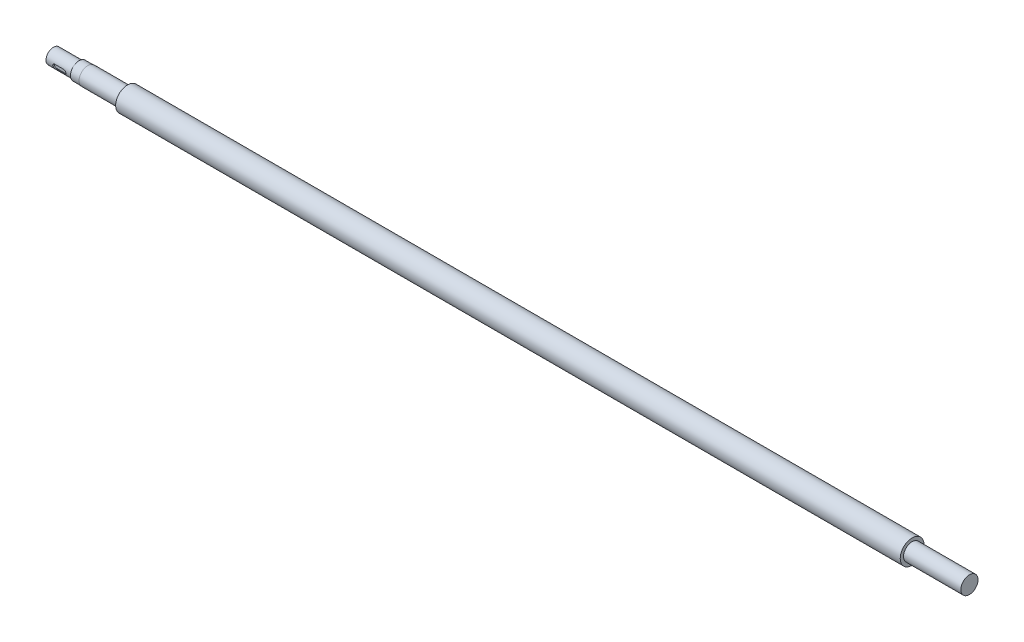
ISO-10303-21;
HEADER;
FILE_DESCRIPTION(('STEP AP214'),'2;1');
FILE_NAME('part.step','',(''),(''),'','','');
FILE_SCHEMA(('AUTOMOTIVE_DESIGN { 1 0 10303 214 1 1 1 1 }'));
ENDSEC;
DATA;
#1=APPLICATION_CONTEXT('core data for automotive mechanical design processes');
#2=APPLICATION_PROTOCOL_DEFINITION('international standard','automotive_design',2000,#1);
#3=PRODUCT_CONTEXT('',#1,'mechanical');
#4=PRODUCT('Part','Part','',(#3));
#5=PRODUCT_RELATED_PRODUCT_CATEGORY('part','',(#4));
#6=PRODUCT_DEFINITION_FORMATION('','',#4);
#7=PRODUCT_DEFINITION_CONTEXT('part definition',#1,'design');
#8=PRODUCT_DEFINITION('design','',#6,#7);
#9=PRODUCT_DEFINITION_SHAPE('','',#8);
#10=(LENGTH_UNIT() NAMED_UNIT(*) SI_UNIT(.MILLI.,.METRE.));
#11=(NAMED_UNIT(*) PLANE_ANGLE_UNIT() SI_UNIT($,.RADIAN.));
#12=(NAMED_UNIT(*) SI_UNIT($,.STERADIAN.) SOLID_ANGLE_UNIT());
#13=UNCERTAINTY_MEASURE_WITH_UNIT(LENGTH_MEASURE(1.E-05),#10,'distance_accuracy_value','');
#14=(GEOMETRIC_REPRESENTATION_CONTEXT(3) GLOBAL_UNCERTAINTY_ASSIGNED_CONTEXT((#13)) GLOBAL_UNIT_ASSIGNED_CONTEXT((#10,
#11,#12)) REPRESENTATION_CONTEXT('',''));
#15=CARTESIAN_POINT('',(0.,0.,0.));
#16=DIRECTION('',(0.,0.,1.));
#17=DIRECTION('',(1.,0.,0.));
#18=AXIS2_PLACEMENT_3D('',#15,#16,#17);
#19=CARTESIAN_POINT('',(0.,0.,0.));
#20=DIRECTION('',(1.,0.,0.));
#21=DIRECTION('',(0.,0.,-1.));
#22=AXIS2_PLACEMENT_3D('',#19,#20,#21);
#23=PLANE('',#22);
#24=CARTESIAN_POINT('',(0.,0.,0.));
#25=DIRECTION('',(-1.,0.,0.));
#26=DIRECTION('',(0.,0.,1.));
#27=AXIS2_PLACEMENT_3D('',#24,#25,#26);
#28=CIRCLE('',#27,17.);
#29=CARTESIAN_POINT('',(0.,0.,17.));
#30=VERTEX_POINT('',#29);
#31=EDGE_CURVE('E133',#30,#30,#28,.T.);
#32=ORIENTED_EDGE('',*,*,#31,.T.);
#33=EDGE_LOOP('',(#32));
#34=FACE_BOUND('',#33,.T.);
#35=ADVANCED_FACE('F38',(#34),#23,.F.);
#36=CARTESIAN_POINT('',(41.3003098914996,0.,0.));
#37=DIRECTION('',(-1.,0.,0.));
#38=DIRECTION('',(0.,0.,1.));
#39=AXIS2_PLACEMENT_3D('',#36,#37,#38);
#40=CYLINDRICAL_SURFACE('',#39,17.);
#41=DIRECTION('',(-1.,0.,0.));
#42=VECTOR('',#41,1.);
#43=CARTESIAN_POINT('',(41.3003098914996,2.,16.8819430161341));
#44=LINE('',#43,#42);
#45=CARTESIAN_POINT('',(20.,2.,16.8819430161341));
#46=VERTEX_POINT('',#45);
#47=CARTESIAN_POINT('',(40.,2.,16.8819430161341));
#48=VERTEX_POINT('',#47);
#49=EDGE_CURVE('E11',#46,#48,#44,.F.);
#50=ORIENTED_EDGE('',*,*,#49,.T.);
#51=CARTESIAN_POINT('',(40.,2.,16.8819430161341));
#52=CARTESIAN_POINT('',(40.1403222273669,2.00001567479681,16.8819278889937));
#53=CARTESIAN_POINT('',(40.2806410056206,1.9940935757898,16.8826423415651));
#54=CARTESIAN_POINT('',(40.5602602282256,1.97048795694987,16.8854208735801));
#55=CARTESIAN_POINT('',(40.6995607623758,1.95280548722904,16.8874848325226));
#56=CARTESIAN_POINT('',(40.9760186933886,1.90581680415216,16.8928501877262));
#57=CARTESIAN_POINT('',(41.1131781005863,1.87652227286804,16.8961503401575));
#58=CARTESIAN_POINT('',(41.3845251020808,1.80652883261543,16.9037776858345));
#59=CARTESIAN_POINT('',(41.5187127035777,1.7658299512808,16.9081048765916));
#60=CARTESIAN_POINT('',(41.7831871142466,1.67331500965025,16.9175108892276));
#61=CARTESIAN_POINT('',(41.9134735157344,1.62149779205161,16.9225897893345));
#62=CARTESIAN_POINT('',(42.1692697648038,1.50709505174714,16.933161669156));
#63=CARTESIAN_POINT('',(42.2947778216909,1.44450553967831,16.9386548018507));
#64=CARTESIAN_POINT('',(42.5400434875581,1.3090367667756,16.9496618392796));
#65=CARTESIAN_POINT('',(42.6598034440809,1.2361617553239,16.9551757345248));
#66=CARTESIAN_POINT('',(42.8928392236823,1.08057795485057,16.9658018032144));
#67=CARTESIAN_POINT('',(43.0061126298478,0.997865535241607,16.9709138271811));
#68=CARTESIAN_POINT('',(43.2257358603045,0.822880251197485,16.980299477548));
#69=CARTESIAN_POINT('',(43.3320588564612,0.730573537641243,16.9845699702717));
#70=CARTESIAN_POINT('',(43.5366061719683,0.537262504106854,16.9917834504762));
#71=CARTESIAN_POINT('',(43.634827461676,0.43625495904896,16.9947259431728));
#72=CARTESIAN_POINT('',(43.8223846195722,0.226326220770309,16.9988173582785));
#73=CARTESIAN_POINT('',(43.9117234126301,0.117407653108047,16.9999668729314));
#74=CARTESIAN_POINT('',(44.0809271302538,-0.10762085977029,17.000031718524));
#75=CARTESIAN_POINT('',(44.1607886215112,-0.223733388071752,16.998946242399));
#76=CARTESIAN_POINT('',(44.3095291814756,-0.4608438585045,16.9941612355899));
#77=CARTESIAN_POINT('',(44.3785261789853,-0.581768440461004,16.9904925441757));
#78=CARTESIAN_POINT('',(44.506180401007,-0.828897295209425,16.9802304711364));
#79=CARTESIAN_POINT('',(44.5648338098989,-0.955103495170882,16.9736360133736));
#80=CARTESIAN_POINT('',(44.6713280574052,-1.211710627626,16.9572483933328));
#81=CARTESIAN_POINT('',(44.7191752904622,-1.34210902696337,16.9474571311649));
#82=CARTESIAN_POINT('',(44.8038084619379,-1.60620611775105,16.9244698558267));
#83=CARTESIAN_POINT('',(44.8405903737485,-1.73990599148478,16.9112726064747));
#84=CARTESIAN_POINT('',(44.9021930135843,-2.0066119936337,16.8816795033758));
#85=CARTESIAN_POINT('',(44.9272551872938,-2.13957060776595,16.865358985858));
#86=CARTESIAN_POINT('',(44.9665057347858,-2.40664301200849,16.8293281586242));
#87=CARTESIAN_POINT('',(44.9806901928683,-2.54075720054486,16.8096166313546));
#88=CARTESIAN_POINT('',(45.0068851768108,-2.94327968023759,16.7454635106077));
#89=CARTESIAN_POINT('',(45.0025981803358,-3.21213451312903,16.6959741482358));
#90=CARTESIAN_POINT('',(44.951402903607,-3.745922614755,16.5844323030533));
#91=CARTESIAN_POINT('',(44.9040378933794,-4.01078287449915,16.5222507436216));
#92=CARTESIAN_POINT('',(44.768506782826,-4.52730291933443,16.3882504830808));
#93=CARTESIAN_POINT('',(44.6803308991532,-4.77895952307754,16.3164294740969));
#94=CARTESIAN_POINT('',(44.4602282341012,-5.27694866510653,16.1624699293598));
#95=CARTESIAN_POINT('',(44.326161610727,-5.52222685230617,16.0799811686927));
#96=CARTESIAN_POINT('',(44.0195996536521,-5.98669945101962,15.912902656451));
#97=CARTESIAN_POINT('',(43.8470873201682,-6.20588225779206,15.8283119902105));
#98=CARTESIAN_POINT('',(43.4574787292029,-6.62372234913186,15.6582147486971));
#99=CARTESIAN_POINT('',(43.2385659981033,-6.82077635574224,15.5728790377374));
#100=CARTESIAN_POINT('',(42.8851551790619,-7.08628063631349,15.4529654641675));
#101=CARTESIAN_POINT('',(42.7630831856744,-7.16981746203227,15.4143182562014));
#102=CARTESIAN_POINT('',(42.5112438093509,-7.32615068676402,15.340631060162));
#103=CARTESIAN_POINT('',(42.381480398449,-7.39895256296918,15.3055892353258));
#104=CARTESIAN_POINT('',(42.1191632082884,-7.53100979048902,15.2410346162796));
#105=CARTESIAN_POINT('',(41.9868181670276,-7.59061305630181,15.2113848651121));
#106=CARTESIAN_POINT('',(41.7166026775204,-7.69834135541057,15.1571493932557));
#107=CARTESIAN_POINT('',(41.5787352609854,-7.74647258849831,15.1325609382921));
#108=CARTESIAN_POINT('',(41.2987506058168,-7.83058725064102,15.0892061635289));
#109=CARTESIAN_POINT('',(41.1566422985999,-7.8665944844881,15.0704284406253));
#110=CARTESIAN_POINT('',(40.8692093191701,-7.92605200391817,15.0392430438543));
#111=CARTESIAN_POINT('',(40.7238868850215,-7.94951075736574,15.0268310745339));
#112=CARTESIAN_POINT('',(40.481849917018,-7.97766271745444,15.0118971119888));
#113=CARTESIAN_POINT('',(40.3856649657228,-7.98603797463698,15.0074403525339));
#114=CARTESIAN_POINT('',(40.1929918666699,-7.9972057997345,15.0014902934328));
#115=CARTESIAN_POINT('',(40.0965041954659,-8.00000478380349,14.9999935879132));
#116=CARTESIAN_POINT('',(40.,-8.,15.));
#117=B_SPLINE_CURVE_WITH_KNOTS('',3,(#51,#52,#53,#54,#55,#56,#57,#58,#59,#60,#61,#62,#63,#64,
#65,#66,#67,#68,#69,#70,#71,#72,#73,#74,#75,#76,#77,#78,#79,#80,#81,#82,#83,#84,#85,#86,#87,#88,
#89,#90,#91,#92,#93,#94,#95,#96,#97,#98,#99,#100,#101,#102,#103,#104,#105,#106,#107,#108,#109,
#110,#111,#112,#113,#114,#115,#116),.UNSPECIFIED.,.F.,.F.,(4,2,2,2,2,2,2,2,2,2,2,2,2,2,2,2,2,2,
2,2,2,2,2,2,2,2,2,2,2,2,2,2,4),(0.,0.420834846241932,0.841632120161297,1.26200712983636,
1.6823811209097,2.1027988897716,2.52337269059569,2.94377324016905,3.36432942676606,
3.78642324646253,4.20867419971625,4.63078564851771,5.05304955032025,5.470355968218,
5.88781600467459,6.30502836244894,6.72239235831175,7.13073142919935,7.53921742282174,
8.35537459518074,9.18028716070733,10.0053975801061,10.8758957282786,11.7467795565502,
12.6618014417654,13.1199578450313,13.5778796725455,14.0217104258328,14.4653007745439,
14.9080150092776,15.3504301170635,15.6401922731837,15.9296208310723),.UNSPECIFIED.);
#118=CARTESIAN_POINT('',(40.,-8.,15.));
#119=VERTEX_POINT('',#118);
#120=EDGE_CURVE('E136',#48,#119,#117,.T.);
#121=ORIENTED_EDGE('',*,*,#120,.T.);
#122=DIRECTION('',(-1.,0.,0.));
#123=VECTOR('',#122,1.);
#124=CARTESIAN_POINT('',(41.3003098914996,-8.,15.));
#125=LINE('',#124,#123);
#126=CARTESIAN_POINT('',(20.,-8.,15.));
#127=VERTEX_POINT('',#126);
#128=EDGE_CURVE('E45',#119,#127,#125,.T.);
#129=ORIENTED_EDGE('',*,*,#128,.T.);
#130=CARTESIAN_POINT('',(20.,-8.,15.));
#131=CARTESIAN_POINT('',(19.8690633972678,-8.00002307897942,14.999973643391));
#132=CARTESIAN_POINT('',(19.7381399374462,-7.99485774640408,15.0027421771378));
#133=CARTESIAN_POINT('',(19.477378973735,-7.97432424011739,15.0136737744954));
#134=CARTESIAN_POINT('',(19.3475410119241,-7.95896061397999,15.0218344336682));
#135=CARTESIAN_POINT('',(19.0905058628226,-7.91830128646715,15.0433040970063));
#136=CARTESIAN_POINT('',(18.9632990426433,-7.89305324301968,15.0565883929604));
#137=CARTESIAN_POINT('',(18.7117838189699,-7.83293052725922,15.0879539734657));
#138=CARTESIAN_POINT('',(18.5874756278524,-7.79805515195983,15.1060356083142));
#139=CARTESIAN_POINT('',(18.3427704465566,-7.7191193705527,15.1465228762266));
#140=CARTESIAN_POINT('',(18.2223672722887,-7.67507439822824,15.1689212389558));
#141=CARTESIAN_POINT('',(17.9859330246604,-7.57819601697861,15.2175517653549));
#142=CARTESIAN_POINT('',(17.8699036273457,-7.52535928017961,15.2437853802929));
#143=CARTESIAN_POINT('',(17.5291710905018,-7.35425616755142,15.3274606968496));
#144=CARTESIAN_POINT('',(17.311854225876,-7.22340687750945,15.3898715940595));
#145=CARTESIAN_POINT('',(16.8879815358453,-6.92265776257088,15.5275822340581));
#146=CARTESIAN_POINT('',(16.6830259097417,-6.75078239033505,15.6034539140822));
#147=CARTESIAN_POINT('',(16.3037933821891,-6.37770246917987,15.7596276521132));
#148=CARTESIAN_POINT('',(16.1295268544487,-6.17648804475478,15.8399311962037));
#149=CARTESIAN_POINT('',(15.8007095203378,-5.72939577809432,16.0073655311788));
#150=CARTESIAN_POINT('',(15.6493511916373,-5.48112699364184,16.0944593435847));
#151=CARTESIAN_POINT('',(15.4558492946778,-5.09090080399434,16.2204065376692));
#152=CARTESIAN_POINT('',(15.3969129892519,-4.95777080775993,16.2616296921566));
#153=CARTESIAN_POINT('',(15.2907010041983,-4.68632947794694,16.3419181167439));
#154=CARTESIAN_POINT('',(15.2434203261337,-4.54802039479943,16.3809843062464));
#155=CARTESIAN_POINT('',(15.1609942839284,-4.26707126105877,16.4564053450025));
#156=CARTESIAN_POINT('',(15.1258524368894,-4.12442996825424,16.4927594060566));
#157=CARTESIAN_POINT('',(15.068175797872,-3.8359061629869,16.5622409522576));
#158=CARTESIAN_POINT('',(15.0456357157631,-3.69002503736339,16.5953697865007));
#159=CARTESIAN_POINT('',(15.0135215534343,-3.39608997334837,16.6580055919286));
#160=CARTESIAN_POINT('',(15.0039457204198,-3.24803633142235,16.6875130522402));
#161=CARTESIAN_POINT('',(14.9980340224925,-2.9509383891806,16.7426037949089));
#162=CARTESIAN_POINT('',(15.0016973132797,-2.80189415264323,16.7681873273984));
#163=CARTESIAN_POINT('',(15.0217780788542,-2.51324055981539,16.8137933736132));
#164=CARTESIAN_POINT('',(15.0373983032681,-2.37361401643254,16.8340609459979));
#165=CARTESIAN_POINT('',(15.0804539545633,-2.0956489052899,16.8709192340477));
#166=CARTESIAN_POINT('',(15.1078934136655,-1.95731079355787,16.887508691968));
#167=CARTESIAN_POINT('',(15.1744609396466,-1.68316317493523,16.9170316733206));
#168=CARTESIAN_POINT('',(15.213582322012,-1.54735226903762,16.9299672793085));
#169=CARTESIAN_POINT('',(15.303307265192,-1.2792242009889,16.9523358517123));
#170=CARTESIAN_POINT('',(15.3539150022604,-1.14690832915848,16.9617675408635));
#171=CARTESIAN_POINT('',(15.4640059939129,-0.892099732677709,16.9770372828417));
#172=CARTESIAN_POINT('',(15.523052771815,-0.769425816233633,16.9830040966252));
#173=CARTESIAN_POINT('',(15.6510241011463,-0.529182798514159,16.9921870826585));
#174=CARTESIAN_POINT('',(15.7199519566069,-0.411615421964486,16.9954023323247));
#175=CARTESIAN_POINT('',(15.8671817257079,-0.182491467638288,16.9994066398519));
#176=CARTESIAN_POINT('',(15.9454820807052,-0.0709338948957917,17.0001961005401));
#177=CARTESIAN_POINT('',(16.1109250078677,0.145415902240337,16.9997223174872));
#178=CARTESIAN_POINT('',(16.198067763285,0.250207986350631,16.9984590311964));
#179=CARTESIAN_POINT('',(16.3814039068596,0.453206125673497,16.9942638581107));
#180=CARTESIAN_POINT('',(16.4776705329087,0.551345726261353,16.991317310812));
#181=CARTESIAN_POINT('',(16.6778965533353,0.739315292517063,16.9841767126028));
#182=CARTESIAN_POINT('',(16.781853444303,0.829147941105172,16.9799830663293));
#183=CARTESIAN_POINT('',(16.9968457550302,0.999990986906751,16.9707790869398));
#184=CARTESIAN_POINT('',(17.1078853192179,1.0809961422226,16.9657682729386));
#185=CARTESIAN_POINT('',(17.3362010400527,1.23355878384774,16.9553584108068));
#186=CARTESIAN_POINT('',(17.4534750296546,1.30511952324022,16.9499594973502));
#187=CARTESIAN_POINT('',(17.6961266817019,1.43980159244783,16.9390565743621));
#188=CARTESIAN_POINT('',(17.8216251370467,1.50270545104627,16.9335528337038));
#189=CARTESIAN_POINT('',(18.0774335051041,1.617726555257,16.9229517716976));
#190=CARTESIAN_POINT('',(18.2077416839954,1.6698476439724,16.9178543059481));
#191=CARTESIAN_POINT('',(18.472223765086,1.76293405545884,16.9084078257091));
#192=CARTESIAN_POINT('',(18.606395327559,1.80390597949185,16.904058368898));
#193=CARTESIAN_POINT('',(18.8776853178235,1.87442806109781,16.8963833248686));
#194=CARTESIAN_POINT('',(19.0148026812232,1.90398227327402,16.8930573742733));
#195=CARTESIAN_POINT('',(19.2928451137041,1.95177477366271,16.8876048246393));
#196=CARTESIAN_POINT('',(19.4337964874666,1.96986203438089,16.8854942649606));
#197=CARTESIAN_POINT('',(19.7164988649468,1.99397266507694,16.8826566305564));
#198=CARTESIAN_POINT('',(19.8582481009014,2.0000165011814,16.881927208884));
#199=CARTESIAN_POINT('',(20.,2.,16.8819430161341));
#200=B_SPLINE_CURVE_WITH_KNOTS('',3,(#130,#131,#132,#133,#134,#135,#136,#137,#138,#139,#140,
#141,#142,#143,#144,#145,#146,#147,#148,#149,#150,#151,#152,#153,#154,#155,#156,#157,#158,#159,
#160,#161,#162,#163,#164,#165,#166,#167,#168,#169,#170,#171,#172,#173,#174,#175,#176,#177,#178,
#179,#180,#181,#182,#183,#184,#185,#186,#187,#188,#189,#190,#191,#192,#193,#194,#195,#196,#197,
#198,#199),.UNSPECIFIED.,.F.,.F.,(4,2,2,2,2,2,2,2,2,2,2,2,2,2,2,2,2,2,2,2,2,2,2,2,2,2,2,2,2,2,2,
2,2,2,4),(0.,0.392658042700618,0.785141110733653,1.17575466851985,1.56639675640055,
1.95638657623723,2.34652435291067,3.12689670206322,3.95764368453853,4.78867094419955,
5.69459641601061,6.14809639185036,6.60140154764561,7.0548379340073,7.508083827829,
7.96126843570782,8.41442414311208,8.83974466122442,9.26521039570562,9.69043313944117,
10.1158107356919,10.5241573134189,10.9326407538161,11.3410563577077,11.7494804274351,
12.1615171480385,12.5734203237313,12.9855667759714,13.3975708937892,13.8185382893167,
14.2393553877538,14.659922781536,15.0803406878517,15.5061866477813,15.9313083224234),.UNSPECIFIED.);
#201=EDGE_CURVE('E52',#127,#46,#200,.T.);
#202=ORIENTED_EDGE('',*,*,#201,.T.);
#203=EDGE_LOOP('',(#50,#121,#129,#202));
#204=FACE_BOUND('',#203,.T.);
#205=ORIENTED_EDGE('',*,*,#31,.F.);
#206=EDGE_LOOP('',(#205));
#207=FACE_BOUND('',#206,.T.);
#208=CARTESIAN_POINT('',(58.,0.,0.));
#209=DIRECTION('',(-1.,0.,0.));
#210=DIRECTION('',(0.,0.,1.));
#211=AXIS2_PLACEMENT_3D('',#208,#209,#210);
#212=CIRCLE('',#211,17.);
#213=CARTESIAN_POINT('',(58.,0.,17.));
#214=VERTEX_POINT('',#213);
#215=EDGE_CURVE('E130',#214,#214,#212,.T.);
#216=ORIENTED_EDGE('',*,*,#215,.T.);
#217=EDGE_LOOP('',(#216));
#218=FACE_BOUND('',#217,.T.);
#219=ADVANCED_FACE('F149',(#204,#207,#218),#40,.T.);
#220=CARTESIAN_POINT('',(58.,17.,0.));
#221=DIRECTION('',(1.,0.,0.));
#222=DIRECTION('',(0.,0.,-1.));
#223=AXIS2_PLACEMENT_3D('',#220,#221,#222);
#224=PLANE('',#223);
#225=ORIENTED_EDGE('',*,*,#215,.F.);
#226=EDGE_LOOP('',(#225));
#227=FACE_BOUND('',#226,.T.);
#228=CARTESIAN_POINT('',(58.,0.,0.));
#229=DIRECTION('',(-1.,0.,0.));
#230=DIRECTION('',(0.,0.,1.));
#231=AXIS2_PLACEMENT_3D('',#228,#229,#230);
#232=CIRCLE('',#231,19.5);
#233=CARTESIAN_POINT('',(58.,0.,19.5));
#234=VERTEX_POINT('',#233);
#235=EDGE_CURVE('E127',#234,#234,#232,.T.);
#236=ORIENTED_EDGE('',*,*,#235,.T.);
#237=EDGE_LOOP('',(#236));
#238=FACE_BOUND('',#237,.T.);
#239=ADVANCED_FACE('F194',(#227,#238),#224,.F.);
#240=CARTESIAN_POINT('',(41.3003098914996,0.,0.));
#241=DIRECTION('',(-1.,0.,0.));
#242=DIRECTION('',(0.,0.,1.));
#243=AXIS2_PLACEMENT_3D('',#240,#241,#242);
#244=CYLINDRICAL_SURFACE('',#243,19.5);
#245=ORIENTED_EDGE('',*,*,#235,.F.);
#246=EDGE_LOOP('',(#245));
#247=FACE_BOUND('',#246,.T.);
#248=CARTESIAN_POINT('',(78.,0.,0.));
#249=DIRECTION('',(-1.,0.,0.));
#250=DIRECTION('',(0.,0.,1.));
#251=AXIS2_PLACEMENT_3D('',#248,#249,#250);
#252=CIRCLE('',#251,19.5);
#253=CARTESIAN_POINT('',(78.,0.,19.5));
#254=VERTEX_POINT('',#253);
#255=EDGE_CURVE('E124',#254,#254,#252,.T.);
#256=ORIENTED_EDGE('',*,*,#255,.T.);
#257=EDGE_LOOP('',(#256));
#258=FACE_BOUND('',#257,.T.);
#259=ADVANCED_FACE('F191',(#247,#258),#244,.T.);
#260=CARTESIAN_POINT('',(78.,19.5,0.));
#261=DIRECTION('',(1.,0.,0.));
#262=DIRECTION('',(0.,0.,-1.));
#263=AXIS2_PLACEMENT_3D('',#260,#261,#262);
#264=PLANE('',#263);
#265=ORIENTED_EDGE('',*,*,#255,.F.);
#266=EDGE_LOOP('',(#265));
#267=FACE_BOUND('',#266,.T.);
#268=CARTESIAN_POINT('',(78.,0.,0.));
#269=DIRECTION('',(-1.,0.,0.));
#270=DIRECTION('',(0.,0.,1.));
#271=AXIS2_PLACEMENT_3D('',#268,#269,#270);
#272=CIRCLE('',#271,20.);
#273=CARTESIAN_POINT('',(78.,0.,20.));
#274=VERTEX_POINT('',#273);
#275=EDGE_CURVE('E121',#274,#274,#272,.T.);
#276=ORIENTED_EDGE('',*,*,#275,.T.);
#277=EDGE_LOOP('',(#276));
#278=FACE_BOUND('',#277,.T.);
#279=ADVANCED_FACE('F187',(#267,#278),#264,.F.);
#280=CARTESIAN_POINT('',(41.3003098914996,0.,0.));
#281=DIRECTION('',(-1.,0.,0.));
#282=DIRECTION('',(0.,0.,1.));
#283=AXIS2_PLACEMENT_3D('',#280,#281,#282);
#284=CYLINDRICAL_SURFACE('',#283,20.);
#285=ORIENTED_EDGE('',*,*,#275,.F.);
#286=EDGE_LOOP('',(#285));
#287=FACE_BOUND('',#286,.T.);
#288=CARTESIAN_POINT('',(168.,0.,0.));
#289=DIRECTION('',(-1.,0.,0.));
#290=DIRECTION('',(0.,0.,1.));
#291=AXIS2_PLACEMENT_3D('',#288,#289,#290);
#292=CIRCLE('',#291,20.);
#293=CARTESIAN_POINT('',(168.,0.,20.));
#294=VERTEX_POINT('',#293);
#295=EDGE_CURVE('E118',#294,#294,#292,.T.);
#296=ORIENTED_EDGE('',*,*,#295,.T.);
#297=EDGE_LOOP('',(#296));
#298=FACE_BOUND('',#297,.T.);
#299=ADVANCED_FACE('F183',(#287,#298),#284,.T.);
#300=CARTESIAN_POINT('',(168.,20.,0.));
#301=DIRECTION('',(1.,0.,0.));
#302=DIRECTION('',(0.,0.,-1.));
#303=AXIS2_PLACEMENT_3D('',#300,#301,#302);
#304=PLANE('',#303);
#305=ORIENTED_EDGE('',*,*,#295,.F.);
#306=EDGE_LOOP('',(#305));
#307=FACE_BOUND('',#306,.T.);
#308=CARTESIAN_POINT('',(168.,0.,0.));
#309=DIRECTION('',(-1.,0.,0.));
#310=DIRECTION('',(0.,0.,1.));
#311=AXIS2_PLACEMENT_3D('',#308,#309,#310);
#312=CIRCLE('',#311,27.);
#313=CARTESIAN_POINT('',(168.,0.,27.));
#314=VERTEX_POINT('',#313);
#315=EDGE_CURVE('E115',#314,#314,#312,.T.);
#316=ORIENTED_EDGE('',*,*,#315,.T.);
#317=EDGE_LOOP('',(#316));
#318=FACE_BOUND('',#317,.T.);
#319=ADVANCED_FACE('F179',(#307,#318),#304,.F.);
#320=CARTESIAN_POINT('',(41.3003098914996,0.,0.));
#321=DIRECTION('',(-1.,0.,0.));
#322=DIRECTION('',(0.,0.,1.));
#323=AXIS2_PLACEMENT_3D('',#320,#321,#322);
#324=CYLINDRICAL_SURFACE('',#323,27.);
#325=ORIENTED_EDGE('',*,*,#315,.F.);
#326=EDGE_LOOP('',(#325));
#327=FACE_BOUND('',#326,.T.);
#328=CARTESIAN_POINT('',(1948.,0.,0.));
#329=DIRECTION('',(-1.,0.,0.));
#330=DIRECTION('',(0.,0.,1.));
#331=AXIS2_PLACEMENT_3D('',#328,#329,#330);
#332=CIRCLE('',#331,27.);
#333=CARTESIAN_POINT('',(1948.,0.,27.));
#334=VERTEX_POINT('',#333);
#335=EDGE_CURVE('E112',#334,#334,#332,.T.);
#336=ORIENTED_EDGE('',*,*,#335,.T.);
#337=EDGE_LOOP('',(#336));
#338=FACE_BOUND('',#337,.T.);
#339=ADVANCED_FACE('F175',(#327,#338),#324,.T.);
#340=CARTESIAN_POINT('',(1948.,27.,0.));
#341=DIRECTION('',(-1.,0.,0.));
#342=DIRECTION('',(0.,0.,1.));
#343=AXIS2_PLACEMENT_3D('',#340,#341,#342);
#344=PLANE('',#343);
#345=ORIENTED_EDGE('',*,*,#335,.F.);
#346=EDGE_LOOP('',(#345));
#347=FACE_BOUND('',#346,.T.);
#348=CARTESIAN_POINT('',(1948.,0.,0.));
#349=DIRECTION('',(-1.,0.,0.));
#350=DIRECTION('',(0.,0.,1.));
#351=AXIS2_PLACEMENT_3D('',#348,#349,#350);
#352=CIRCLE('',#351,19.5);
#353=CARTESIAN_POINT('',(1948.,0.,19.5));
#354=VERTEX_POINT('',#353);
#355=EDGE_CURVE('E109',#354,#354,#352,.T.);
#356=ORIENTED_EDGE('',*,*,#355,.T.);
#357=EDGE_LOOP('',(#356));
#358=FACE_BOUND('',#357,.T.);
#359=ADVANCED_FACE('F171',(#347,#358),#344,.F.);
#360=CARTESIAN_POINT('',(41.3003098914996,0.,0.));
#361=DIRECTION('',(-1.,0.,0.));
#362=DIRECTION('',(0.,0.,1.));
#363=AXIS2_PLACEMENT_3D('',#360,#361,#362);
#364=CYLINDRICAL_SURFACE('',#363,19.5);
#365=ORIENTED_EDGE('',*,*,#355,.F.);
#366=EDGE_LOOP('',(#365));
#367=FACE_BOUND('',#366,.T.);
#368=CARTESIAN_POINT('',(2078.,0.,0.));
#369=DIRECTION('',(-1.,0.,0.));
#370=DIRECTION('',(0.,0.,1.));
#371=AXIS2_PLACEMENT_3D('',#368,#369,#370);
#372=CIRCLE('',#371,19.5);
#373=CARTESIAN_POINT('',(2078.,0.,19.5));
#374=VERTEX_POINT('',#373);
#375=EDGE_CURVE('E103',#374,#374,#372,.T.);
#376=ORIENTED_EDGE('',*,*,#375,.T.);
#377=EDGE_LOOP('',(#376));
#378=FACE_BOUND('',#377,.T.);
#379=ADVANCED_FACE('F167',(#367,#378),#364,.T.);
#380=CARTESIAN_POINT('',(2078.,19.5,0.));
#381=DIRECTION('',(-1.,0.,0.));
#382=DIRECTION('',(0.,0.,1.));
#383=AXIS2_PLACEMENT_3D('',#380,#381,#382);
#384=PLANE('',#383);
#385=ORIENTED_EDGE('',*,*,#375,.F.);
#386=EDGE_LOOP('',(#385));
#387=FACE_BOUND('',#386,.T.);
#388=ADVANCED_FACE('F164',(#387),#384,.F.);
#389=CARTESIAN_POINT('',(20.,-3.,13.));
#390=DIRECTION('',(0.,0.,1.));
#391=DIRECTION('',(1.,0.,0.));
#392=AXIS2_PLACEMENT_3D('',#389,#390,#391);
#393=CYLINDRICAL_SURFACE('',#392,5.);
#394=DIRECTION('',(0.,0.,1.));
#395=VECTOR('',#394,1.);
#396=CARTESIAN_POINT('',(20.,-8.,13.));
#397=LINE('',#396,#395);
#398=CARTESIAN_POINT('',(20.,-8.,13.));
#399=VERTEX_POINT('',#398);
#400=EDGE_CURVE('E75',#399,#127,#397,.T.);
#401=ORIENTED_EDGE('',*,*,#400,.F.);
#402=CARTESIAN_POINT('',(20.,-3.,13.));
#403=DIRECTION('',(0.,0.,1.));
#404=DIRECTION('',(1.,0.,0.));
#405=AXIS2_PLACEMENT_3D('',#402,#403,#404);
#406=CIRCLE('',#405,5.);
#407=CARTESIAN_POINT('',(20.,2.,13.));
#408=VERTEX_POINT('',#407);
#409=EDGE_CURVE('E79',#408,#399,#406,.T.);
#410=ORIENTED_EDGE('',*,*,#409,.F.);
#411=DIRECTION('',(0.,0.,1.));
#412=VECTOR('',#411,1.);
#413=CARTESIAN_POINT('',(20.,2.,13.));
#414=LINE('',#413,#412);
#415=EDGE_CURVE('E101',#408,#46,#414,.T.);
#416=ORIENTED_EDGE('',*,*,#415,.T.);
#417=ORIENTED_EDGE('',*,*,#201,.F.);
#418=EDGE_LOOP('',(#401,#410,#416,#417));
#419=FACE_BOUND('',#418,.T.);
#420=ADVANCED_FACE('F77',(#419),#393,.F.);
#421=CARTESIAN_POINT('',(20.,2.,13.));
#422=DIRECTION('',(0.,1.,0.));
#423=DIRECTION('',(0.,0.,1.));
#424=AXIS2_PLACEMENT_3D('',#421,#422,#423);
#425=PLANE('',#424);
#426=ORIENTED_EDGE('',*,*,#415,.F.);
#427=DIRECTION('',(-1.,0.,0.));
#428=VECTOR('',#427,1.);
#429=CARTESIAN_POINT('',(20.,2.,13.));
#430=LINE('',#429,#428);
#431=CARTESIAN_POINT('',(40.,2.,13.));
#432=VERTEX_POINT('',#431);
#433=EDGE_CURVE('E84',#432,#408,#430,.T.);
#434=ORIENTED_EDGE('',*,*,#433,.F.);
#435=DIRECTION('',(0.,0.,1.));
#436=VECTOR('',#435,1.);
#437=CARTESIAN_POINT('',(40.,2.,13.));
#438=LINE('',#437,#436);
#439=EDGE_CURVE('E104',#432,#48,#438,.T.);
#440=ORIENTED_EDGE('',*,*,#439,.T.);
#441=ORIENTED_EDGE('',*,*,#49,.F.);
#442=EDGE_LOOP('',(#426,#434,#440,#441));
#443=FACE_BOUND('',#442,.T.);
#444=ADVANCED_FACE('F157',(#443),#425,.F.);
#445=CARTESIAN_POINT('',(40.,-3.,13.));
#446=DIRECTION('',(0.,0.,1.));
#447=DIRECTION('',(1.,0.,0.));
#448=AXIS2_PLACEMENT_3D('',#445,#446,#447);
#449=CYLINDRICAL_SURFACE('',#448,5.);
#450=ORIENTED_EDGE('',*,*,#439,.F.);
#451=CARTESIAN_POINT('',(40.,-3.,13.));
#452=DIRECTION('',(0.,0.,1.));
#453=DIRECTION('',(1.,0.,0.));
#454=AXIS2_PLACEMENT_3D('',#451,#452,#453);
#455=CIRCLE('',#454,5.);
#456=CARTESIAN_POINT('',(40.,-8.,13.));
#457=VERTEX_POINT('',#456);
#458=EDGE_CURVE('E93',#457,#432,#455,.T.);
#459=ORIENTED_EDGE('',*,*,#458,.F.);
#460=DIRECTION('',(0.,0.,1.));
#461=VECTOR('',#460,1.);
#462=CARTESIAN_POINT('',(40.,-8.,13.));
#463=LINE('',#462,#461);
#464=EDGE_CURVE('E83',#457,#119,#463,.T.);
#465=ORIENTED_EDGE('',*,*,#464,.T.);
#466=ORIENTED_EDGE('',*,*,#120,.F.);
#467=EDGE_LOOP('',(#450,#459,#465,#466));
#468=FACE_BOUND('',#467,.T.);
#469=ADVANCED_FACE('F152',(#468),#449,.F.);
#470=CARTESIAN_POINT('',(20.,-8.,13.));
#471=DIRECTION('',(0.,-1.,0.));
#472=DIRECTION('',(0.,0.,-1.));
#473=AXIS2_PLACEMENT_3D('',#470,#471,#472);
#474=PLANE('',#473);
#475=ORIENTED_EDGE('',*,*,#464,.F.);
#476=DIRECTION('',(1.,0.,0.));
#477=VECTOR('',#476,1.);
#478=CARTESIAN_POINT('',(20.,-8.,13.));
#479=LINE('',#478,#477);
#480=EDGE_CURVE('E87',#399,#457,#479,.T.);
#481=ORIENTED_EDGE('',*,*,#480,.F.);
#482=ORIENTED_EDGE('',*,*,#400,.T.);
#483=ORIENTED_EDGE('',*,*,#128,.F.);
#484=EDGE_LOOP('',(#475,#481,#482,#483));
#485=FACE_BOUND('',#484,.T.);
#486=ADVANCED_FACE('F88',(#485),#474,.F.);
#487=CARTESIAN_POINT('',(20.,-3.,13.));
#488=DIRECTION('',(0.,0.,1.));
#489=DIRECTION('',(1.,0.,0.));
#490=AXIS2_PLACEMENT_3D('',#487,#488,#489);
#491=PLANE('',#490);
#492=ORIENTED_EDGE('',*,*,#409,.T.);
#493=ORIENTED_EDGE('',*,*,#480,.T.);
#494=ORIENTED_EDGE('',*,*,#458,.T.);
#495=ORIENTED_EDGE('',*,*,#433,.T.);
#496=EDGE_LOOP('',(#492,#493,#494,#495));
#497=FACE_BOUND('',#496,.T.);
#498=ADVANCED_FACE('F95',(#497),#491,.T.);
#499=CLOSED_SHELL('',(#35,#219,#239,#259,#279,#299,#319,#339,#359,#379,#388,#420,#444,#469,#486,#498));
#500=MANIFOLD_SOLID_BREP('B2',#499);
#501=ADVANCED_BREP_SHAPE_REPRESENTATION('',(#18,#500),#14);
#502=SHAPE_DEFINITION_REPRESENTATION(#9,#501);
ENDSEC;
END-ISO-10303-21;
